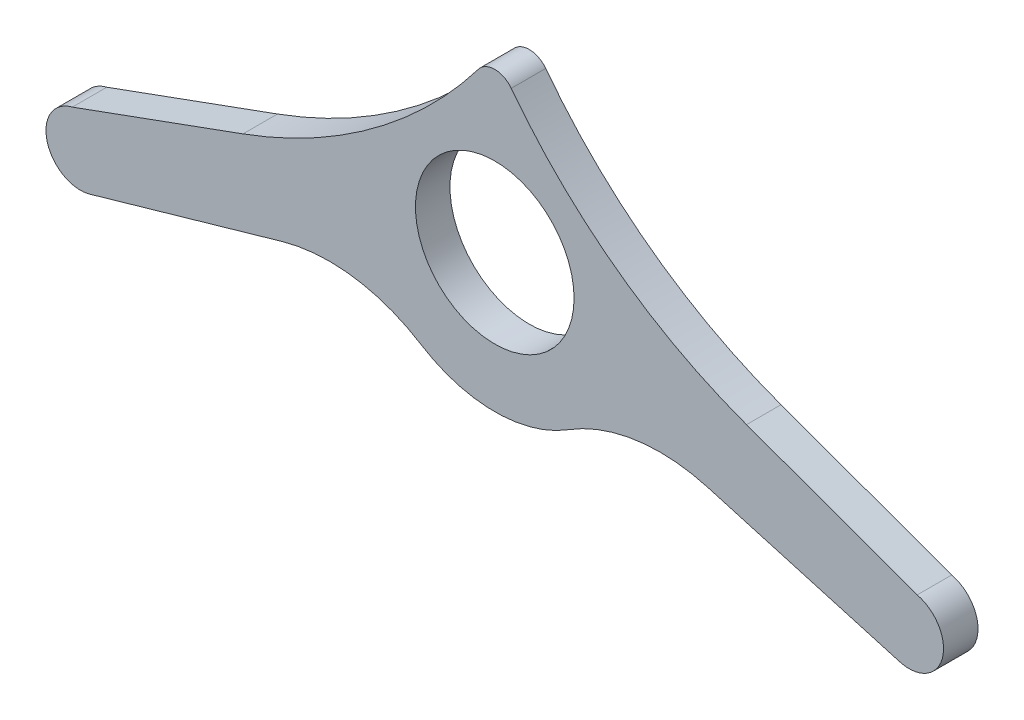
ISO-10303-21;
HEADER;
FILE_DESCRIPTION(('STEP AP214'),'2;1');
FILE_NAME('part.step','',(''),(''),'','','');
FILE_SCHEMA(('AUTOMOTIVE_DESIGN { 1 0 10303 214 1 1 1 1 }'));
ENDSEC;
DATA;
#1=APPLICATION_CONTEXT('core data for automotive mechanical design processes');
#2=APPLICATION_PROTOCOL_DEFINITION('international standard','automotive_design',2000,#1);
#3=PRODUCT_CONTEXT('',#1,'mechanical');
#4=PRODUCT('Part','Part','',(#3));
#5=PRODUCT_RELATED_PRODUCT_CATEGORY('part','',(#4));
#6=PRODUCT_DEFINITION_FORMATION('','',#4);
#7=PRODUCT_DEFINITION_CONTEXT('part definition',#1,'design');
#8=PRODUCT_DEFINITION('design','',#6,#7);
#9=PRODUCT_DEFINITION_SHAPE('','',#8);
#10=(LENGTH_UNIT() NAMED_UNIT(*) SI_UNIT(.MILLI.,.METRE.));
#11=(NAMED_UNIT(*) PLANE_ANGLE_UNIT() SI_UNIT($,.RADIAN.));
#12=(NAMED_UNIT(*) SI_UNIT($,.STERADIAN.) SOLID_ANGLE_UNIT());
#13=UNCERTAINTY_MEASURE_WITH_UNIT(LENGTH_MEASURE(1.E-05),#10,'distance_accuracy_value','');
#14=(GEOMETRIC_REPRESENTATION_CONTEXT(3) GLOBAL_UNCERTAINTY_ASSIGNED_CONTEXT((#13)) GLOBAL_UNIT_ASSIGNED_CONTEXT((#10,
#11,#12)) REPRESENTATION_CONTEXT('',''));
#15=CARTESIAN_POINT('',(0.,0.,0.));
#16=DIRECTION('',(0.,0.,1.));
#17=DIRECTION('',(1.,0.,0.));
#18=AXIS2_PLACEMENT_3D('',#15,#16,#17);
#19=CARTESIAN_POINT('',(60.0788559961451,-17.227334738562,5.));
#20=DIRECTION('',(0.,0.,-1.));
#21=DIRECTION('',(-1.,0.,0.));
#22=AXIS2_PLACEMENT_3D('',#19,#20,#21);
#23=PLANE('',#22);
#24=CARTESIAN_POINT('',(60.0788559961451,-17.227334738562,5.));
#25=DIRECTION('',(0.,0.,1.));
#26=DIRECTION('',(-1.,0.,0.));
#27=AXIS2_PLACEMENT_3D('',#24,#25,#26);
#28=CIRCLE('',#27,5.);
#29=CARTESIAN_POINT('',(58.5095198686686,-21.9746691610561,5.));
#30=VERTEX_POINT('',#29);
#31=CARTESIAN_POINT('',(61.2636874452461,-12.3697453737411,5.));
#32=VERTEX_POINT('',#31);
#33=EDGE_CURVE('E186',#30,#32,#28,.T.);
#34=ORIENTED_EDGE('',*,*,#33,.T.);
#35=DIRECTION('',(-0.939692620785913,0.342020143325655,0.));
#36=VECTOR('',#35,1.);
#37=CARTESIAN_POINT('',(61.2636874452461,-12.3697453737411,5.));
#38=LINE('',#37,#36);
#39=CARTESIAN_POINT('',(36.5094792159095,-3.35995040543553,5.));
#40=VERTEX_POINT('',#39);
#41=EDGE_CURVE('E114',#32,#40,#38,.T.);
#42=ORIENTED_EDGE('',*,*,#41,.T.);
#43=CARTESIAN_POINT('',(62.1609899653337,67.1169961535079,5.));
#44=DIRECTION('',(0.,0.,-1.));
#45=DIRECTION('',(-1.,0.,0.));
#46=AXIS2_PLACEMENT_3D('',#43,#44,#45);
#47=CIRCLE('',#46,75.);
#48=CARTESIAN_POINT('',(2.39080730635899,21.8121921597503,5.));
#49=VERTEX_POINT('',#48);
#50=EDGE_CURVE('E213',#40,#49,#47,.T.);
#51=ORIENTED_EDGE('',*,*,#50,.T.);
#52=CARTESIAN_POINT('',(0.,20.,5.));
#53=DIRECTION('',(0.,0.,1.));
#54=DIRECTION('',(1.,0.,0.));
#55=AXIS2_PLACEMENT_3D('',#52,#53,#54);
#56=CIRCLE('',#55,3.);
#57=CARTESIAN_POINT('',(-2.390807306359,21.8121921597503,5.));
#58=VERTEX_POINT('',#57);
#59=EDGE_CURVE('E232',#49,#58,#56,.T.);
#60=ORIENTED_EDGE('',*,*,#59,.T.);
#61=CARTESIAN_POINT('',(-62.1609899653337,67.1169961535079,5.));
#62=DIRECTION('',(0.,0.,-1.));
#63=DIRECTION('',(1.,0.,0.));
#64=AXIS2_PLACEMENT_3D('',#61,#62,#63);
#65=CIRCLE('',#64,75.);
#66=CARTESIAN_POINT('',(-36.5094792159095,-3.35995040543555,5.));
#67=VERTEX_POINT('',#66);
#68=EDGE_CURVE('E229',#58,#67,#65,.T.);
#69=ORIENTED_EDGE('',*,*,#68,.T.);
#70=DIRECTION('',(-0.939692620785913,-0.342020143325655,0.));
#71=VECTOR('',#70,1.);
#72=CARTESIAN_POINT('',(-61.2636874452461,-12.3697453737411,5.));
#73=LINE('',#72,#71);
#74=CARTESIAN_POINT('',(-61.2636874452461,-12.3697453737412,5.));
#75=VERTEX_POINT('',#74);
#76=EDGE_CURVE('E231',#67,#75,#73,.T.);
#77=ORIENTED_EDGE('',*,*,#76,.T.);
#78=CARTESIAN_POINT('',(-60.0788559961451,-17.227334738562,5.));
#79=DIRECTION('',(0.,0.,1.));
#80=DIRECTION('',(1.,0.,0.));
#81=AXIS2_PLACEMENT_3D('',#78,#79,#80);
#82=CIRCLE('',#81,5.);
#83=CARTESIAN_POINT('',(-58.5095198686686,-21.9746691610561,5.));
#84=VERTEX_POINT('',#83);
#85=EDGE_CURVE('E234',#75,#84,#82,.T.);
#86=ORIENTED_EDGE('',*,*,#85,.T.);
#87=DIRECTION('',(0.961261695938321,0.275637355816993,0.));
#88=VECTOR('',#87,1.);
#89=CARTESIAN_POINT('',(-58.5095198686686,-21.9746691610561,5.));
#90=LINE('',#89,#88);
#91=CARTESIAN_POINT('',(-30.8680537341448,-14.0486062913733,5.));
#92=VERTEX_POINT('',#91);
#93=EDGE_CURVE('E240',#84,#92,#90,.T.);
#94=ORIENTED_EDGE('',*,*,#93,.T.);
#95=CARTESIAN_POINT('',(-23.97711983872,-38.0801486898313,5.));
#96=DIRECTION('',(0.,0.,-1.));
#97=DIRECTION('',(-1.,0.,0.));
#98=AXIS2_PLACEMENT_3D('',#95,#96,#97);
#99=CIRCLE('',#98,25.);
#100=CARTESIAN_POINT('',(-10.6564977060978,-16.9245105288139,5.));
#101=VERTEX_POINT('',#100);
#102=EDGE_CURVE('E145',#92,#101,#99,.T.);
#103=ORIENTED_EDGE('',*,*,#102,.T.);
#104=CARTESIAN_POINT('',(0.,0.,5.));
#105=DIRECTION('',(0.,0.,1.));
#106=DIRECTION('',(1.,0.,0.));
#107=AXIS2_PLACEMENT_3D('',#104,#105,#106);
#108=CIRCLE('',#107,20.);
#109=CARTESIAN_POINT('',(10.6564977060978,-16.9245105288139,5.));
#110=VERTEX_POINT('',#109);
#111=EDGE_CURVE('E139',#101,#110,#108,.T.);
#112=ORIENTED_EDGE('',*,*,#111,.T.);
#113=CARTESIAN_POINT('',(23.97711983872,-38.0801486898313,5.));
#114=DIRECTION('',(0.,0.,-1.));
#115=DIRECTION('',(1.,0.,0.));
#116=AXIS2_PLACEMENT_3D('',#113,#114,#115);
#117=CIRCLE('',#116,25.);
#118=CARTESIAN_POINT('',(30.8680537341448,-14.0486062913733,5.));
#119=VERTEX_POINT('',#118);
#120=EDGE_CURVE('E143',#110,#119,#117,.T.);
#121=ORIENTED_EDGE('',*,*,#120,.T.);
#122=DIRECTION('',(0.961261695938321,-0.275637355816993,0.));
#123=VECTOR('',#122,1.);
#124=CARTESIAN_POINT('',(58.5095198686686,-21.9746691610561,5.));
#125=LINE('',#124,#123);
#126=EDGE_CURVE('E59',#119,#30,#125,.T.);
#127=ORIENTED_EDGE('',*,*,#126,.T.);
#128=EDGE_LOOP('',(#34,#42,#51,#60,#69,#77,#86,#94,#103,#112,#121,#127));
#129=FACE_BOUND('',#128,.T.);
#130=CARTESIAN_POINT('',(0.,0.,5.));
#131=DIRECTION('',(0.,0.,1.));
#132=DIRECTION('',(1.,0.,0.));
#133=AXIS2_PLACEMENT_3D('',#130,#131,#132);
#134=CIRCLE('',#133,11.5);
#135=CARTESIAN_POINT('',(11.5,0.,5.));
#136=VERTEX_POINT('',#135);
#137=EDGE_CURVE('E167',#136,#136,#134,.T.);
#138=ORIENTED_EDGE('',*,*,#137,.F.);
#139=EDGE_LOOP('',(#138));
#140=FACE_BOUND('',#139,.T.);
#141=ADVANCED_FACE('F42',(#129,#140),#23,.F.);
#142=CARTESIAN_POINT('',(60.0788559961451,-17.227334738562,0.));
#143=DIRECTION('',(0.,0.,-1.));
#144=DIRECTION('',(-1.,0.,0.));
#145=AXIS2_PLACEMENT_3D('',#142,#143,#144);
#146=PLANE('',#145);
#147=CARTESIAN_POINT('',(60.0788559961451,-17.227334738562,0.));
#148=DIRECTION('',(0.,0.,1.));
#149=DIRECTION('',(-1.,0.,0.));
#150=AXIS2_PLACEMENT_3D('',#147,#148,#149);
#151=CIRCLE('',#150,5.);
#152=CARTESIAN_POINT('',(58.5095198686686,-21.9746691610561,0.));
#153=VERTEX_POINT('',#152);
#154=CARTESIAN_POINT('',(61.2636874452461,-12.3697453737411,0.));
#155=VERTEX_POINT('',#154);
#156=EDGE_CURVE('E163',#153,#155,#151,.T.);
#157=ORIENTED_EDGE('',*,*,#156,.F.);
#158=DIRECTION('',(0.961261695938321,-0.275637355816993,0.));
#159=VECTOR('',#158,1.);
#160=CARTESIAN_POINT('',(58.5095198686686,-21.9746691610561,0.));
#161=LINE('',#160,#159);
#162=CARTESIAN_POINT('',(30.8680537341448,-14.0486062913733,0.));
#163=VERTEX_POINT('',#162);
#164=EDGE_CURVE('E106',#163,#153,#161,.T.);
#165=ORIENTED_EDGE('',*,*,#164,.F.);
#166=CARTESIAN_POINT('',(23.97711983872,-38.0801486898313,0.));
#167=DIRECTION('',(0.,0.,-1.));
#168=DIRECTION('',(1.,0.,0.));
#169=AXIS2_PLACEMENT_3D('',#166,#167,#168);
#170=CIRCLE('',#169,25.);
#171=CARTESIAN_POINT('',(10.6564977060978,-16.9245105288139,0.));
#172=VERTEX_POINT('',#171);
#173=EDGE_CURVE('E100',#172,#163,#170,.T.);
#174=ORIENTED_EDGE('',*,*,#173,.F.);
#175=CARTESIAN_POINT('',(0.,0.,0.));
#176=DIRECTION('',(0.,0.,1.));
#177=DIRECTION('',(1.,0.,0.));
#178=AXIS2_PLACEMENT_3D('',#175,#176,#177);
#179=CIRCLE('',#178,20.);
#180=CARTESIAN_POINT('',(-10.6564977060978,-16.9245105288139,0.));
#181=VERTEX_POINT('',#180);
#182=EDGE_CURVE('E153',#181,#172,#179,.T.);
#183=ORIENTED_EDGE('',*,*,#182,.F.);
#184=CARTESIAN_POINT('',(-23.97711983872,-38.0801486898313,0.));
#185=DIRECTION('',(0.,0.,-1.));
#186=DIRECTION('',(-1.,0.,0.));
#187=AXIS2_PLACEMENT_3D('',#184,#185,#186);
#188=CIRCLE('',#187,25.);
#189=CARTESIAN_POINT('',(-30.8680537341448,-14.0486062913733,0.));
#190=VERTEX_POINT('',#189);
#191=EDGE_CURVE('E181',#190,#181,#188,.T.);
#192=ORIENTED_EDGE('',*,*,#191,.F.);
#193=DIRECTION('',(0.961261695938321,0.275637355816993,0.));
#194=VECTOR('',#193,1.);
#195=CARTESIAN_POINT('',(-58.5095198686686,-21.9746691610561,0.));
#196=LINE('',#195,#194);
#197=CARTESIAN_POINT('',(-58.5095198686686,-21.9746691610561,0.));
#198=VERTEX_POINT('',#197);
#199=EDGE_CURVE('E179',#198,#190,#196,.T.);
#200=ORIENTED_EDGE('',*,*,#199,.F.);
#201=CARTESIAN_POINT('',(-60.0788559961451,-17.227334738562,0.));
#202=DIRECTION('',(0.,0.,1.));
#203=DIRECTION('',(1.,0.,0.));
#204=AXIS2_PLACEMENT_3D('',#201,#202,#203);
#205=CIRCLE('',#204,5.);
#206=CARTESIAN_POINT('',(-61.2636874452461,-12.3697453737412,0.));
#207=VERTEX_POINT('',#206);
#208=EDGE_CURVE('E177',#207,#198,#205,.T.);
#209=ORIENTED_EDGE('',*,*,#208,.F.);
#210=DIRECTION('',(-0.939692620785913,-0.342020143325655,0.));
#211=VECTOR('',#210,1.);
#212=CARTESIAN_POINT('',(-61.2636874452461,-12.3697453737411,0.));
#213=LINE('',#212,#211);
#214=CARTESIAN_POINT('',(-36.5094792159095,-3.35995040543555,0.));
#215=VERTEX_POINT('',#214);
#216=EDGE_CURVE('E175',#215,#207,#213,.T.);
#217=ORIENTED_EDGE('',*,*,#216,.F.);
#218=CARTESIAN_POINT('',(-62.1609899653337,67.1169961535079,0.));
#219=DIRECTION('',(0.,0.,-1.));
#220=DIRECTION('',(1.,0.,0.));
#221=AXIS2_PLACEMENT_3D('',#218,#219,#220);
#222=CIRCLE('',#221,75.);
#223=CARTESIAN_POINT('',(-2.390807306359,21.8121921597503,0.));
#224=VERTEX_POINT('',#223);
#225=EDGE_CURVE('E173',#224,#215,#222,.T.);
#226=ORIENTED_EDGE('',*,*,#225,.F.);
#227=CARTESIAN_POINT('',(0.,20.,0.));
#228=DIRECTION('',(0.,0.,1.));
#229=DIRECTION('',(1.,0.,0.));
#230=AXIS2_PLACEMENT_3D('',#227,#228,#229);
#231=CIRCLE('',#230,3.);
#232=CARTESIAN_POINT('',(2.39080730635899,21.8121921597503,0.));
#233=VERTEX_POINT('',#232);
#234=EDGE_CURVE('E171',#233,#224,#231,.T.);
#235=ORIENTED_EDGE('',*,*,#234,.F.);
#236=CARTESIAN_POINT('',(62.1609899653337,67.1169961535079,0.));
#237=DIRECTION('',(0.,0.,-1.));
#238=DIRECTION('',(-1.,0.,0.));
#239=AXIS2_PLACEMENT_3D('',#236,#237,#238);
#240=CIRCLE('',#239,75.);
#241=CARTESIAN_POINT('',(36.5094792159095,-3.35995040543553,0.));
#242=VERTEX_POINT('',#241);
#243=EDGE_CURVE('E169',#242,#233,#240,.T.);
#244=ORIENTED_EDGE('',*,*,#243,.F.);
#245=DIRECTION('',(-0.939692620785913,0.342020143325655,0.));
#246=VECTOR('',#245,1.);
#247=CARTESIAN_POINT('',(61.2636874452461,-12.3697453737411,0.));
#248=LINE('',#247,#246);
#249=EDGE_CURVE('E166',#155,#242,#248,.T.);
#250=ORIENTED_EDGE('',*,*,#249,.F.);
#251=EDGE_LOOP('',(#157,#165,#174,#183,#192,#200,#209,#217,#226,#235,#244,#250));
#252=FACE_BOUND('',#251,.T.);
#253=CARTESIAN_POINT('',(0.,0.,0.));
#254=DIRECTION('',(0.,0.,1.));
#255=DIRECTION('',(1.,0.,0.));
#256=AXIS2_PLACEMENT_3D('',#253,#254,#255);
#257=CIRCLE('',#256,11.5);
#258=CARTESIAN_POINT('',(11.5,0.,0.));
#259=VERTEX_POINT('',#258);
#260=EDGE_CURVE('E387',#259,#259,#257,.T.);
#261=ORIENTED_EDGE('',*,*,#260,.T.);
#262=EDGE_LOOP('',(#261));
#263=FACE_BOUND('',#262,.T.);
#264=ADVANCED_FACE('F217',(#252,#263),#146,.T.);
#265=CARTESIAN_POINT('',(60.0788559961451,-17.227334738562,5.));
#266=DIRECTION('',(0.,0.,-1.));
#267=DIRECTION('',(-1.,0.,0.));
#268=AXIS2_PLACEMENT_3D('',#265,#266,#267);
#269=CYLINDRICAL_SURFACE('',#268,5.);
#270=ORIENTED_EDGE('',*,*,#156,.T.);
#271=DIRECTION('',(0.,0.,-1.));
#272=VECTOR('',#271,1.);
#273=CARTESIAN_POINT('',(61.2636874452461,-12.3697453737411,5.));
#274=LINE('',#273,#272);
#275=EDGE_CURVE('E11',#32,#155,#274,.T.);
#276=ORIENTED_EDGE('',*,*,#275,.F.);
#277=ORIENTED_EDGE('',*,*,#33,.F.);
#278=DIRECTION('',(0.,0.,-1.));
#279=VECTOR('',#278,1.);
#280=CARTESIAN_POINT('',(58.5095198686686,-21.9746691610561,5.));
#281=LINE('',#280,#279);
#282=EDGE_CURVE('E159',#30,#153,#281,.T.);
#283=ORIENTED_EDGE('',*,*,#282,.T.);
#284=EDGE_LOOP('',(#270,#276,#277,#283));
#285=FACE_BOUND('',#284,.T.);
#286=ADVANCED_FACE('F44',(#285),#269,.T.);
#287=CARTESIAN_POINT('',(61.2636874452461,-12.3697453737411,5.));
#288=DIRECTION('',(-0.342020143325655,-0.939692620785913,0.));
#289=DIRECTION('',(0.939692620785913,-0.342020143325655,0.));
#290=AXIS2_PLACEMENT_3D('',#287,#288,#289);
#291=PLANE('',#290);
#292=ORIENTED_EDGE('',*,*,#249,.T.);
#293=DIRECTION('',(0.,0.,-1.));
#294=VECTOR('',#293,1.);
#295=CARTESIAN_POINT('',(36.5094792159095,-3.35995040543553,5.));
#296=LINE('',#295,#294);
#297=EDGE_CURVE('E51',#40,#242,#296,.T.);
#298=ORIENTED_EDGE('',*,*,#297,.F.);
#299=ORIENTED_EDGE('',*,*,#41,.F.);
#300=ORIENTED_EDGE('',*,*,#275,.T.);
#301=EDGE_LOOP('',(#292,#298,#299,#300));
#302=FACE_BOUND('',#301,.T.);
#303=ADVANCED_FACE('F274',(#302),#291,.F.);
#304=CARTESIAN_POINT('',(62.1609899653337,67.1169961535079,5.));
#305=DIRECTION('',(0.,0.,-1.));
#306=DIRECTION('',(-1.,0.,0.));
#307=AXIS2_PLACEMENT_3D('',#304,#305,#306);
#308=CYLINDRICAL_SURFACE('',#307,75.);
#309=ORIENTED_EDGE('',*,*,#243,.T.);
#310=DIRECTION('',(0.,0.,-1.));
#311=VECTOR('',#310,1.);
#312=CARTESIAN_POINT('',(2.39080730635899,21.8121921597503,5.));
#313=LINE('',#312,#311);
#314=EDGE_CURVE('E205',#49,#233,#313,.T.);
#315=ORIENTED_EDGE('',*,*,#314,.F.);
#316=ORIENTED_EDGE('',*,*,#50,.F.);
#317=ORIENTED_EDGE('',*,*,#297,.T.);
#318=EDGE_LOOP('',(#309,#315,#316,#317));
#319=FACE_BOUND('',#318,.T.);
#320=ADVANCED_FACE('F211',(#319),#308,.F.);
#321=CARTESIAN_POINT('',(0.,20.,5.));
#322=DIRECTION('',(0.,0.,-1.));
#323=DIRECTION('',(-1.,0.,0.));
#324=AXIS2_PLACEMENT_3D('',#321,#322,#323);
#325=CYLINDRICAL_SURFACE('',#324,3.);
#326=ORIENTED_EDGE('',*,*,#234,.T.);
#327=DIRECTION('',(0.,0.,-1.));
#328=VECTOR('',#327,1.);
#329=CARTESIAN_POINT('',(-2.390807306359,21.8121921597503,5.));
#330=LINE('',#329,#328);
#331=EDGE_CURVE('E202',#58,#224,#330,.T.);
#332=ORIENTED_EDGE('',*,*,#331,.F.);
#333=ORIENTED_EDGE('',*,*,#59,.F.);
#334=ORIENTED_EDGE('',*,*,#314,.T.);
#335=EDGE_LOOP('',(#326,#332,#333,#334));
#336=FACE_BOUND('',#335,.T.);
#337=ADVANCED_FACE('F223',(#336),#325,.T.);
#338=CARTESIAN_POINT('',(-62.1609899653337,67.1169961535079,5.));
#339=DIRECTION('',(0.,0.,-1.));
#340=DIRECTION('',(-1.,0.,0.));
#341=AXIS2_PLACEMENT_3D('',#338,#339,#340);
#342=CYLINDRICAL_SURFACE('',#341,75.);
#343=ORIENTED_EDGE('',*,*,#225,.T.);
#344=DIRECTION('',(0.,0.,-1.));
#345=VECTOR('',#344,1.);
#346=CARTESIAN_POINT('',(-36.5094792159095,-3.35995040543555,5.));
#347=LINE('',#346,#345);
#348=EDGE_CURVE('E199',#67,#215,#347,.T.);
#349=ORIENTED_EDGE('',*,*,#348,.F.);
#350=ORIENTED_EDGE('',*,*,#68,.F.);
#351=ORIENTED_EDGE('',*,*,#331,.T.);
#352=EDGE_LOOP('',(#343,#349,#350,#351));
#353=FACE_BOUND('',#352,.T.);
#354=ADVANCED_FACE('F227',(#353),#342,.F.);
#355=CARTESIAN_POINT('',(-61.2636874452461,-12.3697453737411,5.));
#356=DIRECTION('',(0.342020143325655,-0.939692620785913,0.));
#357=DIRECTION('',(0.939692620785913,0.342020143325655,0.));
#358=AXIS2_PLACEMENT_3D('',#355,#356,#357);
#359=PLANE('',#358);
#360=ORIENTED_EDGE('',*,*,#216,.T.);
#361=DIRECTION('',(0.,0.,-1.));
#362=VECTOR('',#361,1.);
#363=CARTESIAN_POINT('',(-61.2636874452461,-12.3697453737412,5.));
#364=LINE('',#363,#362);
#365=EDGE_CURVE('E196',#75,#207,#364,.T.);
#366=ORIENTED_EDGE('',*,*,#365,.F.);
#367=ORIENTED_EDGE('',*,*,#76,.F.);
#368=ORIENTED_EDGE('',*,*,#348,.T.);
#369=EDGE_LOOP('',(#360,#366,#367,#368));
#370=FACE_BOUND('',#369,.T.);
#371=ADVANCED_FACE('F287',(#370),#359,.F.);
#372=CARTESIAN_POINT('',(-60.0788559961451,-17.227334738562,5.));
#373=DIRECTION('',(0.,0.,-1.));
#374=DIRECTION('',(-1.,0.,0.));
#375=AXIS2_PLACEMENT_3D('',#372,#373,#374);
#376=CYLINDRICAL_SURFACE('',#375,5.);
#377=ORIENTED_EDGE('',*,*,#208,.T.);
#378=DIRECTION('',(0.,0.,-1.));
#379=VECTOR('',#378,1.);
#380=CARTESIAN_POINT('',(-58.5095198686686,-21.9746691610561,5.));
#381=LINE('',#380,#379);
#382=EDGE_CURVE('E193',#84,#198,#381,.T.);
#383=ORIENTED_EDGE('',*,*,#382,.F.);
#384=ORIENTED_EDGE('',*,*,#85,.F.);
#385=ORIENTED_EDGE('',*,*,#365,.T.);
#386=EDGE_LOOP('',(#377,#383,#384,#385));
#387=FACE_BOUND('',#386,.T.);
#388=ADVANCED_FACE('F290',(#387),#376,.T.);
#389=CARTESIAN_POINT('',(-58.5095198686686,-21.9746691610561,5.));
#390=DIRECTION('',(-0.275637355816993,0.961261695938321,0.));
#391=DIRECTION('',(-0.961261695938321,-0.275637355816993,0.));
#392=AXIS2_PLACEMENT_3D('',#389,#390,#391);
#393=PLANE('',#392);
#394=ORIENTED_EDGE('',*,*,#199,.T.);
#395=DIRECTION('',(0.,0.,-1.));
#396=VECTOR('',#395,1.);
#397=CARTESIAN_POINT('',(-30.8680537341448,-14.0486062913733,5.));
#398=LINE('',#397,#396);
#399=EDGE_CURVE('E190',#92,#190,#398,.T.);
#400=ORIENTED_EDGE('',*,*,#399,.F.);
#401=ORIENTED_EDGE('',*,*,#93,.F.);
#402=ORIENTED_EDGE('',*,*,#382,.T.);
#403=EDGE_LOOP('',(#394,#400,#401,#402));
#404=FACE_BOUND('',#403,.T.);
#405=ADVANCED_FACE('F246',(#404),#393,.F.);
#406=CARTESIAN_POINT('',(-23.97711983872,-38.0801486898313,5.));
#407=DIRECTION('',(0.,0.,-1.));
#408=DIRECTION('',(-1.,0.,0.));
#409=AXIS2_PLACEMENT_3D('',#406,#407,#408);
#410=CYLINDRICAL_SURFACE('',#409,25.);
#411=ORIENTED_EDGE('',*,*,#191,.T.);
#412=DIRECTION('',(0.,0.,-1.));
#413=VECTOR('',#412,1.);
#414=CARTESIAN_POINT('',(-10.6564977060978,-16.9245105288139,5.));
#415=LINE('',#414,#413);
#416=EDGE_CURVE('E154',#101,#181,#415,.T.);
#417=ORIENTED_EDGE('',*,*,#416,.F.);
#418=ORIENTED_EDGE('',*,*,#102,.F.);
#419=ORIENTED_EDGE('',*,*,#399,.T.);
#420=EDGE_LOOP('',(#411,#417,#418,#419));
#421=FACE_BOUND('',#420,.T.);
#422=ADVANCED_FACE('F250',(#421),#410,.F.);
#423=CARTESIAN_POINT('',(0.,0.,5.));
#424=DIRECTION('',(0.,0.,-1.));
#425=DIRECTION('',(-1.,0.,0.));
#426=AXIS2_PLACEMENT_3D('',#423,#424,#425);
#427=CYLINDRICAL_SURFACE('',#426,20.);
#428=ORIENTED_EDGE('',*,*,#182,.T.);
#429=DIRECTION('',(0.,0.,-1.));
#430=VECTOR('',#429,1.);
#431=CARTESIAN_POINT('',(10.6564977060978,-16.9245105288139,5.));
#432=LINE('',#431,#430);
#433=EDGE_CURVE('E150',#110,#172,#432,.T.);
#434=ORIENTED_EDGE('',*,*,#433,.F.);
#435=ORIENTED_EDGE('',*,*,#111,.F.);
#436=ORIENTED_EDGE('',*,*,#416,.T.);
#437=EDGE_LOOP('',(#428,#434,#435,#436));
#438=FACE_BOUND('',#437,.T.);
#439=ADVANCED_FACE('F151',(#438),#427,.T.);
#440=CARTESIAN_POINT('',(23.97711983872,-38.0801486898313,5.));
#441=DIRECTION('',(0.,0.,-1.));
#442=DIRECTION('',(-1.,0.,0.));
#443=AXIS2_PLACEMENT_3D('',#440,#441,#442);
#444=CYLINDRICAL_SURFACE('',#443,25.);
#445=ORIENTED_EDGE('',*,*,#173,.T.);
#446=DIRECTION('',(0.,0.,-1.));
#447=VECTOR('',#446,1.);
#448=CARTESIAN_POINT('',(30.8680537341448,-14.0486062913733,5.));
#449=LINE('',#448,#447);
#450=EDGE_CURVE('E155',#119,#163,#449,.T.);
#451=ORIENTED_EDGE('',*,*,#450,.F.);
#452=ORIENTED_EDGE('',*,*,#120,.F.);
#453=ORIENTED_EDGE('',*,*,#433,.T.);
#454=EDGE_LOOP('',(#445,#451,#452,#453));
#455=FACE_BOUND('',#454,.T.);
#456=ADVANCED_FACE('F157',(#455),#444,.F.);
#457=CARTESIAN_POINT('',(58.5095198686686,-21.9746691610561,5.));
#458=DIRECTION('',(0.275637355816993,0.961261695938321,0.));
#459=DIRECTION('',(-0.961261695938321,0.275637355816993,0.));
#460=AXIS2_PLACEMENT_3D('',#457,#458,#459);
#461=PLANE('',#460);
#462=ORIENTED_EDGE('',*,*,#164,.T.);
#463=ORIENTED_EDGE('',*,*,#282,.F.);
#464=ORIENTED_EDGE('',*,*,#126,.F.);
#465=ORIENTED_EDGE('',*,*,#450,.T.);
#466=EDGE_LOOP('',(#462,#463,#464,#465));
#467=FACE_BOUND('',#466,.T.);
#468=ADVANCED_FACE('F254',(#467),#461,.F.);
#469=CARTESIAN_POINT('',(0.,0.,5.));
#470=DIRECTION('',(0.,0.,-1.));
#471=DIRECTION('',(-1.,0.,0.));
#472=AXIS2_PLACEMENT_3D('',#469,#470,#471);
#473=CYLINDRICAL_SURFACE('',#472,11.5);
#474=ORIENTED_EDGE('',*,*,#137,.T.);
#475=EDGE_LOOP('',(#474));
#476=FACE_BOUND('',#475,.T.);
#477=ORIENTED_EDGE('',*,*,#260,.F.);
#478=EDGE_LOOP('',(#477));
#479=FACE_BOUND('',#478,.T.);
#480=ADVANCED_FACE('F256',(#476,#479),#473,.F.);
#481=CLOSED_SHELL('',(#141,#264,#286,#303,#320,#337,#354,#371,#388,#405,#422,#439,#456,#468,#480));
#482=MANIFOLD_SOLID_BREP('B2',#481);
#483=ADVANCED_BREP_SHAPE_REPRESENTATION('',(#18,#482),#14);
#484=SHAPE_DEFINITION_REPRESENTATION(#9,#483);
ENDSEC;
END-ISO-10303-21;
